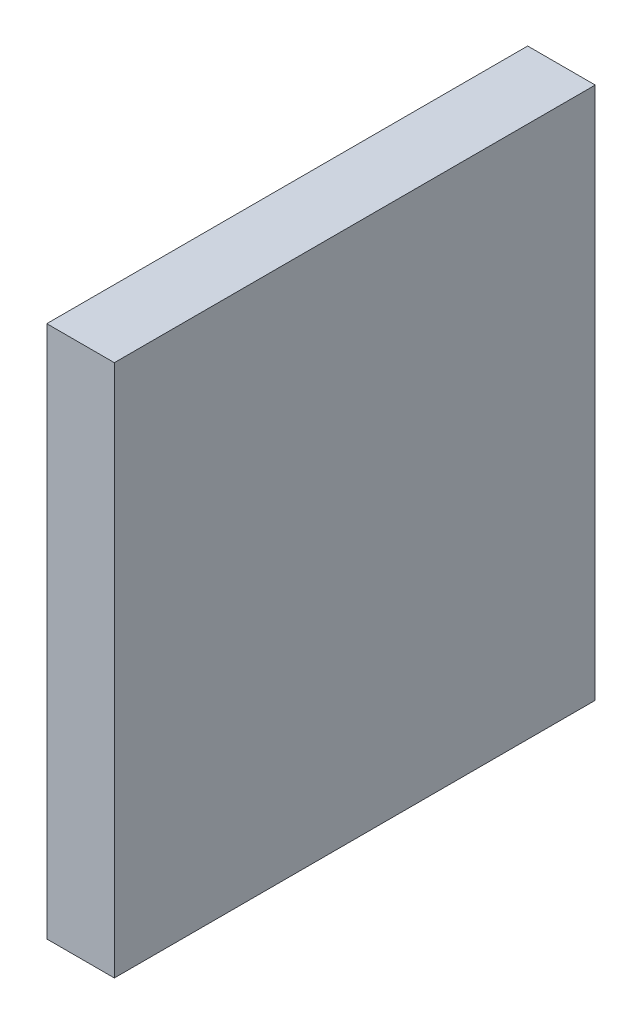
ISO-10303-21;
HEADER;
FILE_DESCRIPTION(('STEP AP214'),'2;1');
FILE_NAME('part.step','',(''),(''),'','','');
FILE_SCHEMA(('AUTOMOTIVE_DESIGN { 1 0 10303 214 1 1 1 1 }'));
ENDSEC;
DATA;
#1=APPLICATION_CONTEXT('core data for automotive mechanical design processes');
#2=APPLICATION_PROTOCOL_DEFINITION('international standard','automotive_design',2000,#1);
#3=PRODUCT_CONTEXT('',#1,'mechanical');
#4=PRODUCT('Part','Part','',(#3));
#5=PRODUCT_RELATED_PRODUCT_CATEGORY('part','',(#4));
#6=PRODUCT_DEFINITION_FORMATION('','',#4);
#7=PRODUCT_DEFINITION_CONTEXT('part definition',#1,'design');
#8=PRODUCT_DEFINITION('design','',#6,#7);
#9=PRODUCT_DEFINITION_SHAPE('','',#8);
#10=(LENGTH_UNIT() NAMED_UNIT(*) SI_UNIT(.MILLI.,.METRE.));
#11=(NAMED_UNIT(*) PLANE_ANGLE_UNIT() SI_UNIT($,.RADIAN.));
#12=(NAMED_UNIT(*) SI_UNIT($,.STERADIAN.) SOLID_ANGLE_UNIT());
#13=UNCERTAINTY_MEASURE_WITH_UNIT(LENGTH_MEASURE(1.E-05),#10,'distance_accuracy_value','');
#14=(GEOMETRIC_REPRESENTATION_CONTEXT(3) GLOBAL_UNCERTAINTY_ASSIGNED_CONTEXT((#13)) GLOBAL_UNIT_ASSIGNED_CONTEXT((#10,
#11,#12)) REPRESENTATION_CONTEXT('',''));
#15=CARTESIAN_POINT('',(0.,0.,0.));
#16=DIRECTION('',(0.,0.,1.));
#17=DIRECTION('',(1.,0.,0.));
#18=AXIS2_PLACEMENT_3D('',#15,#16,#17);
#19=CARTESIAN_POINT('',(24.28,-50.24,192.5));
#20=DIRECTION('',(0.,1.,0.));
#21=DIRECTION('',(1.,0.,0.));
#22=AXIS2_PLACEMENT_3D('',#19,#20,#21);
#23=PLANE('',#22);
#24=DIRECTION('',(0.,0.,1.));
#25=VECTOR('',#24,1.);
#26=CARTESIAN_POINT('',(26.88,-50.24,192.5));
#27=LINE('',#26,#25);
#28=CARTESIAN_POINT('',(26.88,-50.24,192.5));
#29=VERTEX_POINT('',#28);
#30=CARTESIAN_POINT('',(26.88,-50.24,211.));
#31=VERTEX_POINT('',#30);
#32=EDGE_CURVE('E71',#29,#31,#27,.T.);
#33=ORIENTED_EDGE('',*,*,#32,.T.);
#34=DIRECTION('',(1.,0.,0.));
#35=VECTOR('',#34,1.);
#36=CARTESIAN_POINT('',(24.28,-50.24,211.));
#37=LINE('',#36,#35);
#38=CARTESIAN_POINT('',(24.28,-50.24,211.));
#39=VERTEX_POINT('',#38);
#40=EDGE_CURVE('E66',#39,#31,#37,.T.);
#41=ORIENTED_EDGE('',*,*,#40,.F.);
#42=DIRECTION('',(0.,0.,1.));
#43=VECTOR('',#42,1.);
#44=CARTESIAN_POINT('',(24.28,-50.24,192.5));
#45=LINE('',#44,#43);
#46=CARTESIAN_POINT('',(24.28,-50.24,192.5));
#47=VERTEX_POINT('',#46);
#48=EDGE_CURVE('E68',#47,#39,#45,.T.);
#49=ORIENTED_EDGE('',*,*,#48,.F.);
#50=DIRECTION('',(1.,0.,0.));
#51=VECTOR('',#50,1.);
#52=CARTESIAN_POINT('',(24.28,-50.24,192.5));
#53=LINE('',#52,#51);
#54=EDGE_CURVE('E9',#47,#29,#53,.T.);
#55=ORIENTED_EDGE('',*,*,#54,.T.);
#56=EDGE_LOOP('',(#33,#41,#49,#55));
#57=FACE_BOUND('',#56,.T.);
#58=ADVANCED_FACE('F14',(#57),#23,.F.);
#59=CARTESIAN_POINT('',(24.28,-50.24,192.5));
#60=DIRECTION('',(0.,0.,1.));
#61=DIRECTION('',(1.,0.,0.));
#62=AXIS2_PLACEMENT_3D('',#59,#60,#61);
#63=PLANE('',#62);
#64=DIRECTION('',(1.,0.,0.));
#65=VECTOR('',#64,1.);
#66=CARTESIAN_POINT('',(24.28,-29.74,192.5));
#67=LINE('',#66,#65);
#68=CARTESIAN_POINT('',(24.28,-29.74,192.5));
#69=VERTEX_POINT('',#68);
#70=CARTESIAN_POINT('',(26.88,-29.74,192.5));
#71=VERTEX_POINT('',#70);
#72=EDGE_CURVE('E24',#69,#71,#67,.T.);
#73=ORIENTED_EDGE('',*,*,#72,.T.);
#74=DIRECTION('',(0.,1.,0.));
#75=VECTOR('',#74,1.);
#76=CARTESIAN_POINT('',(26.88,-50.24,192.5));
#77=LINE('',#76,#75);
#78=EDGE_CURVE('E106',#29,#71,#77,.T.);
#79=ORIENTED_EDGE('',*,*,#78,.F.);
#80=ORIENTED_EDGE('',*,*,#54,.F.);
#81=DIRECTION('',(0.,1.,0.));
#82=VECTOR('',#81,1.);
#83=CARTESIAN_POINT('',(24.28,-50.24,192.5));
#84=LINE('',#83,#82);
#85=EDGE_CURVE('E84',#47,#69,#84,.T.);
#86=ORIENTED_EDGE('',*,*,#85,.T.);
#87=EDGE_LOOP('',(#73,#79,#80,#86));
#88=FACE_BOUND('',#87,.T.);
#89=ADVANCED_FACE('F123',(#88),#63,.F.);
#90=CARTESIAN_POINT('',(24.28,-29.74,192.5));
#91=DIRECTION('',(0.,1.,0.));
#92=DIRECTION('',(1.,0.,0.));
#93=AXIS2_PLACEMENT_3D('',#90,#91,#92);
#94=PLANE('',#93);
#95=ORIENTED_EDGE('',*,*,#72,.F.);
#96=DIRECTION('',(0.,0.,-1.));
#97=VECTOR('',#96,1.);
#98=CARTESIAN_POINT('',(24.28,-29.74,211.));
#99=LINE('',#98,#97);
#100=CARTESIAN_POINT('',(24.28,-29.74,211.));
#101=VERTEX_POINT('',#100);
#102=EDGE_CURVE('E18',#101,#69,#99,.T.);
#103=ORIENTED_EDGE('',*,*,#102,.F.);
#104=DIRECTION('',(1.,0.,0.));
#105=VECTOR('',#104,1.);
#106=CARTESIAN_POINT('',(24.28,-29.74,211.));
#107=LINE('',#106,#105);
#108=CARTESIAN_POINT('',(26.88,-29.74,211.));
#109=VERTEX_POINT('',#108);
#110=EDGE_CURVE('E89',#101,#109,#107,.T.);
#111=ORIENTED_EDGE('',*,*,#110,.T.);
#112=DIRECTION('',(0.,0.,-1.));
#113=VECTOR('',#112,1.);
#114=CARTESIAN_POINT('',(26.88,-29.74,211.));
#115=LINE('',#114,#113);
#116=EDGE_CURVE('E98',#109,#71,#115,.T.);
#117=ORIENTED_EDGE('',*,*,#116,.T.);
#118=EDGE_LOOP('',(#95,#103,#111,#117));
#119=FACE_BOUND('',#118,.T.);
#120=ADVANCED_FACE('F16',(#119),#94,.T.);
#121=CARTESIAN_POINT('',(26.88,-50.24,192.5));
#122=DIRECTION('',(1.,0.,0.));
#123=DIRECTION('',(0.,1.,0.));
#124=AXIS2_PLACEMENT_3D('',#121,#122,#123);
#125=PLANE('',#124);
#126=ORIENTED_EDGE('',*,*,#32,.F.);
#127=ORIENTED_EDGE('',*,*,#78,.T.);
#128=ORIENTED_EDGE('',*,*,#116,.F.);
#129=DIRECTION('',(0.,1.,0.));
#130=VECTOR('',#129,1.);
#131=CARTESIAN_POINT('',(26.88,-50.24,211.));
#132=LINE('',#131,#130);
#133=EDGE_CURVE('E77',#31,#109,#132,.T.);
#134=ORIENTED_EDGE('',*,*,#133,.F.);
#135=EDGE_LOOP('',(#126,#127,#128,#134));
#136=FACE_BOUND('',#135,.T.);
#137=ADVANCED_FACE('F115',(#136),#125,.T.);
#138=CARTESIAN_POINT('',(24.28,-50.24,211.));
#139=DIRECTION('',(0.,0.,1.));
#140=DIRECTION('',(1.,0.,0.));
#141=AXIS2_PLACEMENT_3D('',#138,#139,#140);
#142=PLANE('',#141);
#143=DIRECTION('',(0.,1.,0.));
#144=VECTOR('',#143,1.);
#145=CARTESIAN_POINT('',(24.28,-50.24,211.));
#146=LINE('',#145,#144);
#147=EDGE_CURVE('E83',#39,#101,#146,.T.);
#148=ORIENTED_EDGE('',*,*,#147,.F.);
#149=ORIENTED_EDGE('',*,*,#40,.T.);
#150=ORIENTED_EDGE('',*,*,#133,.T.);
#151=ORIENTED_EDGE('',*,*,#110,.F.);
#152=EDGE_LOOP('',(#148,#149,#150,#151));
#153=FACE_BOUND('',#152,.T.);
#154=ADVANCED_FACE('F87',(#153),#142,.T.);
#155=CARTESIAN_POINT('',(24.28,-50.24,192.5));
#156=DIRECTION('',(1.,0.,0.));
#157=DIRECTION('',(0.,1.,0.));
#158=AXIS2_PLACEMENT_3D('',#155,#156,#157);
#159=PLANE('',#158);
#160=ORIENTED_EDGE('',*,*,#147,.T.);
#161=ORIENTED_EDGE('',*,*,#102,.T.);
#162=ORIENTED_EDGE('',*,*,#85,.F.);
#163=ORIENTED_EDGE('',*,*,#48,.T.);
#164=EDGE_LOOP('',(#160,#161,#162,#163));
#165=FACE_BOUND('',#164,.T.);
#166=ADVANCED_FACE('F81',(#165),#159,.F.);
#167=CLOSED_SHELL('',(#58,#89,#120,#137,#154,#166));
#168=MANIFOLD_SOLID_BREP('B1',#167);
#169=ADVANCED_BREP_SHAPE_REPRESENTATION('',(#18,#168),#14);
#170=SHAPE_DEFINITION_REPRESENTATION(#9,#169);
ENDSEC;
END-ISO-10303-21;
